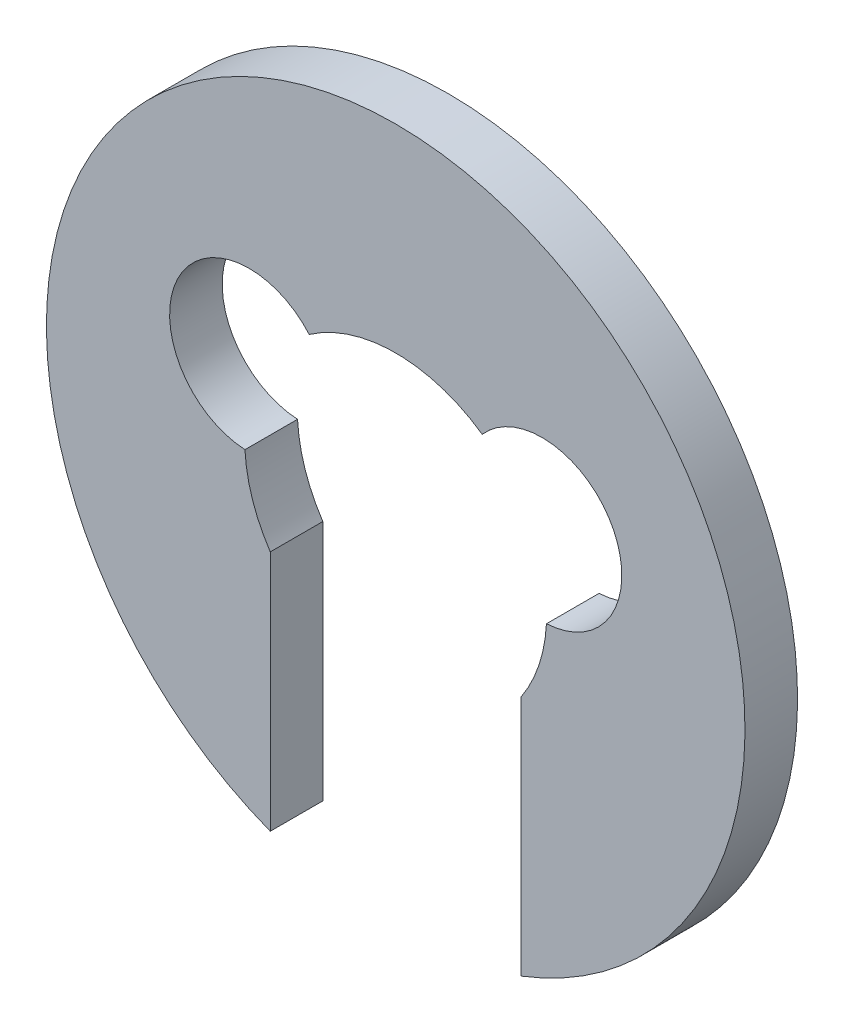
ISO-10303-21;
HEADER;
FILE_DESCRIPTION(('STEP AP214'),'2;1');
FILE_NAME('part.step','',(''),(''),'','','');
FILE_SCHEMA(('AUTOMOTIVE_DESIGN { 1 0 10303 214 1 1 1 1 }'));
ENDSEC;
DATA;
#1=APPLICATION_CONTEXT('core data for automotive mechanical design processes');
#2=APPLICATION_PROTOCOL_DEFINITION('international standard','automotive_design',2000,#1);
#3=PRODUCT_CONTEXT('',#1,'mechanical');
#4=PRODUCT('Part','Part','',(#3));
#5=PRODUCT_RELATED_PRODUCT_CATEGORY('part','',(#4));
#6=PRODUCT_DEFINITION_FORMATION('','',#4);
#7=PRODUCT_DEFINITION_CONTEXT('part definition',#1,'design');
#8=PRODUCT_DEFINITION('design','',#6,#7);
#9=PRODUCT_DEFINITION_SHAPE('','',#8);
#10=(LENGTH_UNIT() NAMED_UNIT(*) SI_UNIT(.MILLI.,.METRE.));
#11=(NAMED_UNIT(*) PLANE_ANGLE_UNIT() SI_UNIT($,.RADIAN.));
#12=(NAMED_UNIT(*) SI_UNIT($,.STERADIAN.) SOLID_ANGLE_UNIT());
#13=UNCERTAINTY_MEASURE_WITH_UNIT(LENGTH_MEASURE(1.E-05),#10,'distance_accuracy_value','');
#14=(GEOMETRIC_REPRESENTATION_CONTEXT(3) GLOBAL_UNCERTAINTY_ASSIGNED_CONTEXT((#13)) GLOBAL_UNIT_ASSIGNED_CONTEXT((#10,
#11,#12)) REPRESENTATION_CONTEXT('',''));
#15=CARTESIAN_POINT('',(0.,0.,0.));
#16=DIRECTION('',(0.,0.,1.));
#17=DIRECTION('',(1.,0.,0.));
#18=AXIS2_PLACEMENT_3D('',#15,#16,#17);
#19=CARTESIAN_POINT('',(0.,0.,8.18));
#20=DIRECTION('',(0.,0.,-1.));
#21=DIRECTION('',(-1.,0.,0.));
#22=AXIS2_PLACEMENT_3D('',#19,#20,#21);
#23=CYLINDRICAL_SURFACE('',#22,2.01);
#24=CARTESIAN_POINT('',(0.,0.,8.18));
#25=DIRECTION('',(0.,0.,1.));
#26=DIRECTION('',(1.,0.,0.));
#27=AXIS2_PLACEMENT_3D('',#24,#25,#26);
#28=CIRCLE('',#27,2.01);
#29=CARTESIAN_POINT('',(1.67,-1.11857051632876,8.18));
#30=VERTEX_POINT('',#29);
#31=CARTESIAN_POINT('',(2.00707147052623,-0.108462492132798,8.18));
#32=VERTEX_POINT('',#31);
#33=EDGE_CURVE('E111',#30,#32,#28,.T.);
#34=ORIENTED_EDGE('',*,*,#33,.T.);
#35=DIRECTION('',(0.,0.,-1.));
#36=VECTOR('',#35,1.);
#37=CARTESIAN_POINT('',(2.00707147052623,-0.108462492132798,7.835));
#38=LINE('',#37,#36);
#39=CARTESIAN_POINT('',(2.00707147052623,-0.108462492132798,7.48));
#40=VERTEX_POINT('',#39);
#41=EDGE_CURVE('E103',#32,#40,#38,.T.);
#42=ORIENTED_EDGE('',*,*,#41,.T.);
#43=CARTESIAN_POINT('',(0.,0.,7.48));
#44=DIRECTION('',(0.,0.,1.));
#45=DIRECTION('',(1.,0.,0.));
#46=AXIS2_PLACEMENT_3D('',#43,#44,#45);
#47=CIRCLE('',#46,2.01);
#48=CARTESIAN_POINT('',(1.67,-1.11857051632876,7.48));
#49=VERTEX_POINT('',#48);
#50=EDGE_CURVE('E115',#49,#40,#47,.T.);
#51=ORIENTED_EDGE('',*,*,#50,.F.);
#52=DIRECTION('',(0.,0.,-1.));
#53=VECTOR('',#52,1.);
#54=CARTESIAN_POINT('',(1.67,-1.11857051632876,8.18));
#55=LINE('',#54,#53);
#56=EDGE_CURVE('E174',#49,#30,#55,.F.);
#57=ORIENTED_EDGE('',*,*,#56,.T.);
#58=EDGE_LOOP('',(#34,#42,#51,#57));
#59=FACE_BOUND('',#58,.T.);
#60=ADVANCED_FACE('F39',(#59),#23,.F.);
#61=CARTESIAN_POINT('',(1.15167985784783,1.6473413444176,7.48));
#62=VERTEX_POINT('',#61);
#63=CARTESIAN_POINT('',(-1.15167985784783,1.6473413444176,7.48));
#64=VERTEX_POINT('',#63);
#65=EDGE_CURVE('E122',#62,#64,#47,.T.);
#66=ORIENTED_EDGE('',*,*,#65,.F.);
#67=DIRECTION('',(0.,0.,-1.));
#68=VECTOR('',#67,1.);
#69=CARTESIAN_POINT('',(1.15167985784783,1.6473413444176,7.835));
#70=LINE('',#69,#68);
#71=CARTESIAN_POINT('',(1.15167985784783,1.6473413444176,8.18));
#72=VERTEX_POINT('',#71);
#73=EDGE_CURVE('E52',#62,#72,#70,.F.);
#74=ORIENTED_EDGE('',*,*,#73,.T.);
#75=CARTESIAN_POINT('',(-1.15167985784783,1.6473413444176,8.18));
#76=VERTEX_POINT('',#75);
#77=EDGE_CURVE('E125',#72,#76,#28,.T.);
#78=ORIENTED_EDGE('',*,*,#77,.T.);
#79=DIRECTION('',(0.,0.,-1.));
#80=VECTOR('',#79,1.);
#81=CARTESIAN_POINT('',(-1.15167985784783,1.6473413444176,7.835));
#82=LINE('',#81,#80);
#83=EDGE_CURVE('E50',#76,#64,#82,.T.);
#84=ORIENTED_EDGE('',*,*,#83,.T.);
#85=EDGE_LOOP('',(#66,#74,#78,#84));
#86=FACE_BOUND('',#85,.T.);
#87=ADVANCED_FACE('F146',(#86),#23,.F.);
#88=CARTESIAN_POINT('',(-2.00707147052623,-0.108462492132799,7.48));
#89=VERTEX_POINT('',#88);
#90=CARTESIAN_POINT('',(-1.67,-1.11857051632876,7.48));
#91=VERTEX_POINT('',#90);
#92=EDGE_CURVE('E123',#89,#91,#47,.T.);
#93=ORIENTED_EDGE('',*,*,#92,.F.);
#94=DIRECTION('',(0.,0.,-1.));
#95=VECTOR('',#94,1.);
#96=CARTESIAN_POINT('',(-2.00707147052623,-0.108462492132798,7.835));
#97=LINE('',#96,#95);
#98=CARTESIAN_POINT('',(-2.00707147052623,-0.108462492132799,8.18));
#99=VERTEX_POINT('',#98);
#100=EDGE_CURVE('E153',#89,#99,#97,.F.);
#101=ORIENTED_EDGE('',*,*,#100,.T.);
#102=CARTESIAN_POINT('',(-1.67,-1.11857051632876,8.18));
#103=VERTEX_POINT('',#102);
#104=EDGE_CURVE('E121',#99,#103,#28,.T.);
#105=ORIENTED_EDGE('',*,*,#104,.T.);
#106=DIRECTION('',(0.,0.,-1.));
#107=VECTOR('',#106,1.);
#108=CARTESIAN_POINT('',(-1.67,-1.11857051632876,8.18));
#109=LINE('',#108,#107);
#110=EDGE_CURVE('E169',#103,#91,#109,.T.);
#111=ORIENTED_EDGE('',*,*,#110,.T.);
#112=EDGE_LOOP('',(#93,#101,#105,#111));
#113=FACE_BOUND('',#112,.T.);
#114=ADVANCED_FACE('F168',(#113),#23,.F.);
#115=CARTESIAN_POINT('',(0.,0.,8.18));
#116=DIRECTION('',(0.,0.,1.));
#117=DIRECTION('',(1.,0.,0.));
#118=AXIS2_PLACEMENT_3D('',#115,#116,#117);
#119=PLANE('',#118);
#120=ORIENTED_EDGE('',*,*,#77,.F.);
#121=CARTESIAN_POINT('',(1.95,0.95,8.18));
#122=DIRECTION('',(0.,0.,1.));
#123=DIRECTION('',(1.,0.,0.));
#124=AXIS2_PLACEMENT_3D('',#121,#122,#123);
#125=CIRCLE('',#124,1.06);
#126=EDGE_CURVE('E113',#72,#32,#125,.F.);
#127=ORIENTED_EDGE('',*,*,#126,.T.);
#128=ORIENTED_EDGE('',*,*,#33,.F.);
#129=DIRECTION('',(0.,-1.,0.));
#130=VECTOR('',#129,1.);
#131=CARTESIAN_POINT('',(1.67,0.,8.18));
#132=LINE('',#131,#130);
#133=CARTESIAN_POINT('',(1.67,-4.33976957913666,8.18));
#134=VERTEX_POINT('',#133);
#135=EDGE_CURVE('E160',#30,#134,#132,.T.);
#136=ORIENTED_EDGE('',*,*,#135,.T.);
#137=CARTESIAN_POINT('',(0.,0.,8.18));
#138=DIRECTION('',(0.,0.,1.));
#139=DIRECTION('',(1.,0.,0.));
#140=AXIS2_PLACEMENT_3D('',#137,#138,#139);
#141=CIRCLE('',#140,4.65);
#142=CARTESIAN_POINT('',(-1.67,-4.33976957913666,8.18));
#143=VERTEX_POINT('',#142);
#144=EDGE_CURVE('E141',#134,#143,#141,.T.);
#145=ORIENTED_EDGE('',*,*,#144,.T.);
#146=DIRECTION('',(0.,1.,0.));
#147=VECTOR('',#146,1.);
#148=CARTESIAN_POINT('',(-1.67,0.,8.18));
#149=LINE('',#148,#147);
#150=EDGE_CURVE('E135',#143,#103,#149,.T.);
#151=ORIENTED_EDGE('',*,*,#150,.T.);
#152=ORIENTED_EDGE('',*,*,#104,.F.);
#153=CARTESIAN_POINT('',(-1.95,0.95,8.18));
#154=DIRECTION('',(0.,0.,1.));
#155=DIRECTION('',(1.,0.,0.));
#156=AXIS2_PLACEMENT_3D('',#153,#154,#155);
#157=CIRCLE('',#156,1.06);
#158=EDGE_CURVE('E64',#99,#76,#157,.F.);
#159=ORIENTED_EDGE('',*,*,#158,.T.);
#160=EDGE_LOOP('',(#120,#127,#128,#136,#145,#151,#152,#159));
#161=FACE_BOUND('',#160,.T.);
#162=ADVANCED_FACE('F154',(#161),#119,.T.);
#163=CARTESIAN_POINT('',(0.,0.,7.48));
#164=DIRECTION('',(0.,0.,1.));
#165=DIRECTION('',(1.,0.,0.));
#166=AXIS2_PLACEMENT_3D('',#163,#164,#165);
#167=PLANE('',#166);
#168=CARTESIAN_POINT('',(1.95,0.95,7.48));
#169=DIRECTION('',(0.,0.,1.));
#170=DIRECTION('',(1.,0.,0.));
#171=AXIS2_PLACEMENT_3D('',#168,#169,#170);
#172=CIRCLE('',#171,1.06);
#173=EDGE_CURVE('E11',#62,#40,#172,.F.);
#174=ORIENTED_EDGE('',*,*,#173,.F.);
#175=ORIENTED_EDGE('',*,*,#65,.T.);
#176=CARTESIAN_POINT('',(-1.95,0.95,7.48));
#177=DIRECTION('',(0.,0.,1.));
#178=DIRECTION('',(1.,0.,0.));
#179=AXIS2_PLACEMENT_3D('',#176,#177,#178);
#180=CIRCLE('',#179,1.06);
#181=EDGE_CURVE('E155',#89,#64,#180,.F.);
#182=ORIENTED_EDGE('',*,*,#181,.F.);
#183=ORIENTED_EDGE('',*,*,#92,.T.);
#184=DIRECTION('',(0.,1.,0.));
#185=VECTOR('',#184,1.);
#186=CARTESIAN_POINT('',(-1.67,0.,7.48));
#187=LINE('',#186,#185);
#188=CARTESIAN_POINT('',(-1.67,-4.33976957913666,7.48));
#189=VERTEX_POINT('',#188);
#190=EDGE_CURVE('E139',#189,#91,#187,.T.);
#191=ORIENTED_EDGE('',*,*,#190,.F.);
#192=CARTESIAN_POINT('',(0.,0.,7.48));
#193=DIRECTION('',(0.,0.,1.));
#194=DIRECTION('',(1.,0.,0.));
#195=AXIS2_PLACEMENT_3D('',#192,#193,#194);
#196=CIRCLE('',#195,4.65);
#197=CARTESIAN_POINT('',(1.67,-4.33976957913666,7.48));
#198=VERTEX_POINT('',#197);
#199=EDGE_CURVE('E143',#198,#189,#196,.T.);
#200=ORIENTED_EDGE('',*,*,#199,.F.);
#201=DIRECTION('',(0.,-1.,0.));
#202=VECTOR('',#201,1.);
#203=CARTESIAN_POINT('',(1.67,0.,7.48));
#204=LINE('',#203,#202);
#205=EDGE_CURVE('E117',#49,#198,#204,.T.);
#206=ORIENTED_EDGE('',*,*,#205,.F.);
#207=ORIENTED_EDGE('',*,*,#50,.T.);
#208=EDGE_LOOP('',(#174,#175,#182,#183,#191,#200,#206,#207));
#209=FACE_BOUND('',#208,.T.);
#210=ADVANCED_FACE('F120',(#209),#167,.F.);
#211=CARTESIAN_POINT('',(0.,0.,8.18));
#212=DIRECTION('',(0.,0.,-1.));
#213=DIRECTION('',(-1.,0.,0.));
#214=AXIS2_PLACEMENT_3D('',#211,#212,#213);
#215=CYLINDRICAL_SURFACE('',#214,4.65);
#216=DIRECTION('',(0.,0.,-1.));
#217=VECTOR('',#216,1.);
#218=CARTESIAN_POINT('',(-1.67,-4.33976957913666,8.18));
#219=LINE('',#218,#217);
#220=EDGE_CURVE('E126',#143,#189,#219,.T.);
#221=ORIENTED_EDGE('',*,*,#220,.F.);
#222=ORIENTED_EDGE('',*,*,#144,.F.);
#223=DIRECTION('',(0.,0.,-1.));
#224=VECTOR('',#223,1.);
#225=CARTESIAN_POINT('',(1.67,-4.33976957913666,8.18));
#226=LINE('',#225,#224);
#227=EDGE_CURVE('E163',#198,#134,#226,.F.);
#228=ORIENTED_EDGE('',*,*,#227,.F.);
#229=ORIENTED_EDGE('',*,*,#199,.T.);
#230=EDGE_LOOP('',(#221,#222,#228,#229));
#231=FACE_BOUND('',#230,.T.);
#232=ADVANCED_FACE('F41',(#231),#215,.T.);
#233=CARTESIAN_POINT('',(1.67,-4.8,8.21));
#234=DIRECTION('',(-1.,0.,0.));
#235=DIRECTION('',(0.,0.,1.));
#236=AXIS2_PLACEMENT_3D('',#233,#234,#235);
#237=PLANE('',#236);
#238=ORIENTED_EDGE('',*,*,#227,.T.);
#239=ORIENTED_EDGE('',*,*,#135,.F.);
#240=ORIENTED_EDGE('',*,*,#56,.F.);
#241=ORIENTED_EDGE('',*,*,#205,.T.);
#242=EDGE_LOOP('',(#238,#239,#240,#241));
#243=FACE_BOUND('',#242,.T.);
#244=ADVANCED_FACE('F180',(#243),#237,.T.);
#245=CARTESIAN_POINT('',(-1.67,0.3,8.21));
#246=DIRECTION('',(1.,0.,0.));
#247=DIRECTION('',(0.,0.,-1.));
#248=AXIS2_PLACEMENT_3D('',#245,#246,#247);
#249=PLANE('',#248);
#250=ORIENTED_EDGE('',*,*,#220,.T.);
#251=ORIENTED_EDGE('',*,*,#190,.T.);
#252=ORIENTED_EDGE('',*,*,#110,.F.);
#253=ORIENTED_EDGE('',*,*,#150,.F.);
#254=EDGE_LOOP('',(#250,#251,#252,#253));
#255=FACE_BOUND('',#254,.T.);
#256=ADVANCED_FACE('F170',(#255),#249,.T.);
#257=CARTESIAN_POINT('',(-1.95,0.95,8.21));
#258=DIRECTION('',(0.,0.,-1.));
#259=DIRECTION('',(-1.,0.,0.));
#260=AXIS2_PLACEMENT_3D('',#257,#258,#259);
#261=CYLINDRICAL_SURFACE('',#260,1.06);
#262=ORIENTED_EDGE('',*,*,#158,.F.);
#263=ORIENTED_EDGE('',*,*,#100,.F.);
#264=ORIENTED_EDGE('',*,*,#181,.T.);
#265=ORIENTED_EDGE('',*,*,#83,.F.);
#266=EDGE_LOOP('',(#262,#263,#264,#265));
#267=FACE_BOUND('',#266,.T.);
#268=ADVANCED_FACE('F151',(#267),#261,.F.);
#269=CARTESIAN_POINT('',(1.95,0.95,8.21));
#270=DIRECTION('',(0.,0.,-1.));
#271=DIRECTION('',(-1.,0.,0.));
#272=AXIS2_PLACEMENT_3D('',#269,#270,#271);
#273=CYLINDRICAL_SURFACE('',#272,1.06);
#274=ORIENTED_EDGE('',*,*,#73,.F.);
#275=ORIENTED_EDGE('',*,*,#173,.T.);
#276=ORIENTED_EDGE('',*,*,#41,.F.);
#277=ORIENTED_EDGE('',*,*,#126,.F.);
#278=EDGE_LOOP('',(#274,#275,#276,#277));
#279=FACE_BOUND('',#278,.T.);
#280=ADVANCED_FACE('F105',(#279),#273,.F.);
#281=CLOSED_SHELL('',(#60,#87,#114,#162,#210,#232,#244,#256,#268,#280));
#282=MANIFOLD_SOLID_BREP('B2',#281);
#283=ADVANCED_BREP_SHAPE_REPRESENTATION('',(#18,#282),#14);
#284=SHAPE_DEFINITION_REPRESENTATION(#9,#283);
ENDSEC;
END-ISO-10303-21;
